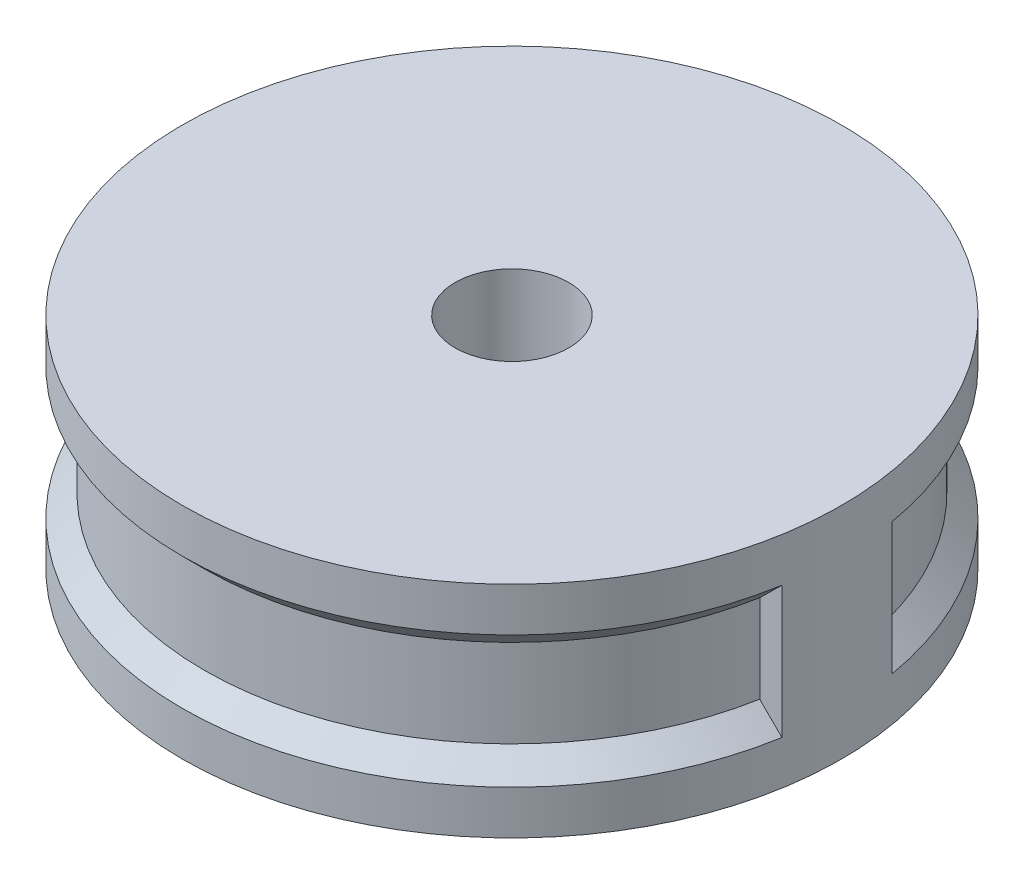
ISO-10303-21;
HEADER;
FILE_DESCRIPTION(('STEP AP214'),'2;1');
FILE_NAME('part.step','',(''),(''),'','','');
FILE_SCHEMA(('AUTOMOTIVE_DESIGN { 1 0 10303 214 1 1 1 1 }'));
ENDSEC;
DATA;
#1=APPLICATION_CONTEXT('core data for automotive mechanical design processes');
#2=APPLICATION_PROTOCOL_DEFINITION('international standard','automotive_design',2000,#1);
#3=PRODUCT_CONTEXT('',#1,'mechanical');
#4=PRODUCT('Part','Part','',(#3));
#5=PRODUCT_RELATED_PRODUCT_CATEGORY('part','',(#4));
#6=PRODUCT_DEFINITION_FORMATION('','',#4);
#7=PRODUCT_DEFINITION_CONTEXT('part definition',#1,'design');
#8=PRODUCT_DEFINITION('design','',#6,#7);
#9=PRODUCT_DEFINITION_SHAPE('','',#8);
#10=(LENGTH_UNIT() NAMED_UNIT(*) SI_UNIT(.MILLI.,.METRE.));
#11=(NAMED_UNIT(*) PLANE_ANGLE_UNIT() SI_UNIT($,.RADIAN.));
#12=(NAMED_UNIT(*) SI_UNIT($,.STERADIAN.) SOLID_ANGLE_UNIT());
#13=UNCERTAINTY_MEASURE_WITH_UNIT(LENGTH_MEASURE(1.E-05),#10,'distance_accuracy_value','');
#14=(GEOMETRIC_REPRESENTATION_CONTEXT(3) GLOBAL_UNCERTAINTY_ASSIGNED_CONTEXT((#13)) GLOBAL_UNIT_ASSIGNED_CONTEXT((#10,
#11,#12)) REPRESENTATION_CONTEXT('',''));
#15=CARTESIAN_POINT('',(0.,0.,0.));
#16=DIRECTION('',(0.,0.,1.));
#17=DIRECTION('',(1.,0.,0.));
#18=AXIS2_PLACEMENT_3D('',#15,#16,#17);
#19=CARTESIAN_POINT('',(0.,10.,0.));
#20=DIRECTION('',(0.,-1.,0.));
#21=DIRECTION('',(0.,0.,-1.));
#22=AXIS2_PLACEMENT_3D('',#19,#20,#21);
#23=CYLINDRICAL_SURFACE('',#22,14.);
#24=DIRECTION('',(0.,-1.,0.));
#25=VECTOR('',#24,1.);
#26=CARTESIAN_POINT('',(13.790199457749,10.,2.41462189907613));
#27=LINE('',#26,#25);
#28=CARTESIAN_POINT('',(13.790199457749,7.00000000000001,2.41462189907613));
#29=VERTEX_POINT('',#28);
#30=CARTESIAN_POINT('',(13.790199457749,3.,2.41462189907613));
#31=VERTEX_POINT('',#30);
#32=EDGE_CURVE('E164',#29,#31,#27,.T.);
#33=ORIENTED_EDGE('',*,*,#32,.F.);
#34=CARTESIAN_POINT('',(0.,7.00000000000001,0.));
#35=DIRECTION('',(0.,1.,0.));
#36=DIRECTION('',(0.,0.,1.));
#37=AXIS2_PLACEMENT_3D('',#34,#35,#36);
#38=CIRCLE('',#37,14.);
#39=CARTESIAN_POINT('',(13.790199457749,7.00000000000001,-2.41462189907614));
#40=VERTEX_POINT('',#39);
#41=EDGE_CURVE('E138',#29,#40,#38,.F.);
#42=ORIENTED_EDGE('',*,*,#41,.T.);
#43=DIRECTION('',(0.,-1.,0.));
#44=VECTOR('',#43,1.);
#45=CARTESIAN_POINT('',(13.790199457749,10.,-2.41462189907614));
#46=LINE('',#45,#44);
#47=CARTESIAN_POINT('',(13.790199457749,3.,-2.41462189907614));
#48=VERTEX_POINT('',#47);
#49=EDGE_CURVE('E194',#48,#40,#46,.F.);
#50=ORIENTED_EDGE('',*,*,#49,.F.);
#51=CARTESIAN_POINT('',(0.,3.,0.));
#52=DIRECTION('',(0.,1.,0.));
#53=DIRECTION('',(0.,0.,1.));
#54=AXIS2_PLACEMENT_3D('',#51,#52,#53);
#55=CIRCLE('',#54,14.);
#56=EDGE_CURVE('E198',#48,#31,#55,.T.);
#57=ORIENTED_EDGE('',*,*,#56,.T.);
#58=EDGE_LOOP('',(#33,#42,#50,#57));
#59=FACE_BOUND('',#58,.T.);
#60=ADVANCED_FACE('F57',(#59),#23,.T.);
#61=CARTESIAN_POINT('',(0.,8.,0.));
#62=DIRECTION('',(0.,1.,0.));
#63=DIRECTION('',(0.,0.,1.));
#64=AXIS2_PLACEMENT_3D('',#61,#62,#63);
#65=CONICAL_SURFACE('',#64,15.,0.785398163397453);
#66=CARTESIAN_POINT('',(12.3757858953759,5.62577033405038,-2.5));
#67=CARTESIAN_POINT('',(12.6955827246215,5.93924340125824,-2.5));
#68=CARTESIAN_POINT('',(13.0151495674288,6.25295088112389,-2.5));
#69=CARTESIAN_POINT('',(13.6538981383868,6.88075703972242,-2.5));
#70=CARTESIAN_POINT('',(13.973079866935,7.19485571805104,-2.5));
#71=CARTESIAN_POINT('',(14.6111336106725,7.82336717952537,-2.5));
#72=CARTESIAN_POINT('',(14.9300056259754,8.13777996255585,-2.5));
#73=CARTESIAN_POINT('',(15.5674908724013,8.76686843647522,-2.5));
#74=CARTESIAN_POINT('',(15.8861041032578,9.08154412763407,-2.5));
#75=CARTESIAN_POINT('',(16.2046130201221,9.39632529355011,-2.5));
#76=B_SPLINE_CURVE_WITH_KNOTS('',3,(#66,#67,#68,#69,#70,#71,#72,#73,#74,#75),.UNSPECIFIED.,.F.,
.F.,(4,2,2,2,4),(0.,1.34343495719193,2.68686852726906,4.03030160464996,5.37373606317071),.UNSPECIFIED.);
#77=CARTESIAN_POINT('',(13.790199457749,7.01497774113473,-2.5));
#78=VERTEX_POINT('',#77);
#79=CARTESIAN_POINT('',(14.790199457749,8.,-2.5));
#80=VERTEX_POINT('',#79);
#81=EDGE_CURVE('E80',#78,#80,#76,.T.);
#82=ORIENTED_EDGE('',*,*,#81,.F.);
#83=CARTESIAN_POINT('',(13.790199457749,7.01510262447272,2.5007));
#84=CARTESIAN_POINT('',(13.790199457749,6.98442599035101,2.32882080578309));
#85=CARTESIAN_POINT('',(13.790199457749,6.95673101614068,2.15640321524656));
#86=CARTESIAN_POINT('',(13.790199457749,6.90751342624309,1.81067555850645));
#87=CARTESIAN_POINT('',(13.790199457749,6.88599133115325,1.63736541828255));
#88=CARTESIAN_POINT('',(13.790199457749,6.84932660763172,1.28999805574772));
#89=CARTESIAN_POINT('',(13.790199457749,6.83418647966881,1.11594056755517));
#90=CARTESIAN_POINT('',(13.790199457749,6.81043966344074,0.767394307805772));
#91=CARTESIAN_POINT('',(13.790199457749,6.80183274263274,0.592905551821276));
#92=CARTESIAN_POINT('',(13.790199457749,6.78609877416651,0.0736346358576556));
#93=CARTESIAN_POINT('',(13.790199457749,6.78857757441452,-0.271486769294978));
#94=CARTESIAN_POINT('',(13.790199457749,6.81931830946131,-0.960386110849853));
#95=CARTESIAN_POINT('',(13.790199457749,6.8475667747092,-1.30416465488697));
#96=CARTESIAN_POINT('',(13.790199457749,6.90505758112435,-1.7891853538384));
#97=CARTESIAN_POINT('',(13.790199457749,6.92412561233425,-1.93169743981785));
#98=CARTESIAN_POINT('',(13.790199457749,6.96647992398493,-2.2164916779307));
#99=CARTESIAN_POINT('',(13.790199457749,6.9897775789506,-2.35877214001628));
#100=CARTESIAN_POINT('',(13.790199457749,7.01510262447272,-2.5007));
#101=B_SPLINE_CURVE_WITH_KNOTS('',3,(#83,#84,#85,#86,#87,#88,#89,#90,#91,#92,#93,#94,#95,#96,
#97,#98,#99,#100),.UNSPECIFIED.,.F.,.F.,(4,2,2,2,2,2,2,2,4),(0.,0.52376821018417,
1.04758058003074,1.57159799038902,2.09559674800926,3.1299493955207,4.16376170663854,
4.59505836230388,5.0275325434474),.UNSPECIFIED.);
#102=EDGE_CURVE('E203',#40,#78,#101,.T.);
#103=ORIENTED_EDGE('',*,*,#102,.F.);
#104=ORIENTED_EDGE('',*,*,#41,.F.);
#105=CARTESIAN_POINT('',(13.790199457749,7.01497774113474,2.5));
#106=VERTEX_POINT('',#105);
#107=EDGE_CURVE('E87',#106,#29,#101,.T.);
#108=ORIENTED_EDGE('',*,*,#107,.F.);
#109=CARTESIAN_POINT('',(16.2046130201221,9.39632529355011,2.5));
#110=CARTESIAN_POINT('',(15.8861041032578,9.08154412763407,2.5));
#111=CARTESIAN_POINT('',(15.5674908724013,8.76686843647522,2.5));
#112=CARTESIAN_POINT('',(14.9300056259754,8.13777996255585,2.5));
#113=CARTESIAN_POINT('',(14.6111336106725,7.82336717952537,2.5));
#114=CARTESIAN_POINT('',(13.973079866935,7.19485571805104,2.5));
#115=CARTESIAN_POINT('',(13.6538981383868,6.88075703972242,2.5));
#116=CARTESIAN_POINT('',(13.0151495674288,6.2529508811239,2.5));
#117=CARTESIAN_POINT('',(12.6955827246215,5.93924340125825,2.5));
#118=CARTESIAN_POINT('',(12.3757858953759,5.62577033405038,2.5));
#119=B_SPLINE_CURVE_WITH_KNOTS('',3,(#109,#110,#111,#112,#113,#114,#115,#116,#117,#118),
.UNSPECIFIED.,.F.,.F.,(4,2,2,2,4),(0.,1.34343445852074,2.68686753590165,4.03030110597877,
5.3737360631707),.UNSPECIFIED.);
#120=CARTESIAN_POINT('',(14.790199457749,8.,2.5));
#121=VERTEX_POINT('',#120);
#122=EDGE_CURVE('E156',#121,#106,#119,.T.);
#123=ORIENTED_EDGE('',*,*,#122,.F.);
#124=CARTESIAN_POINT('',(0.,8.,0.));
#125=DIRECTION('',(0.,1.,0.));
#126=DIRECTION('',(0.,0.,1.));
#127=AXIS2_PLACEMENT_3D('',#124,#125,#126);
#128=CIRCLE('',#127,15.);
#129=EDGE_CURVE('E143',#80,#121,#128,.T.);
#130=ORIENTED_EDGE('',*,*,#129,.F.);
#131=EDGE_LOOP('',(#82,#103,#104,#108,#123,#130));
#132=FACE_BOUND('',#131,.T.);
#133=ADVANCED_FACE('F167',(#132),#65,.T.);
#134=CARTESIAN_POINT('',(0.,3.,0.));
#135=DIRECTION('',(0.,-1.,0.));
#136=DIRECTION('',(0.,0.,-1.));
#137=AXIS2_PLACEMENT_3D('',#134,#135,#136);
#138=CONICAL_SURFACE('',#137,14.,0.785398163397442);
#139=CARTESIAN_POINT('',(16.2046130201221,0.60367470644984,-2.5));
#140=CARTESIAN_POINT('',(15.8861041032578,0.918455872365883,-2.5));
#141=CARTESIAN_POINT('',(15.5674908724013,1.23313156352474,-2.5));
#142=CARTESIAN_POINT('',(14.9300056259755,1.86222003744412,-2.5));
#143=CARTESIAN_POINT('',(14.6111336106725,2.17663282047461,-2.5));
#144=CARTESIAN_POINT('',(13.973079866935,2.80514428194896,-2.5));
#145=CARTESIAN_POINT('',(13.6538981383868,3.11924296027759,-2.5));
#146=CARTESIAN_POINT('',(13.0151495674288,3.74704911887612,-2.5));
#147=CARTESIAN_POINT('',(12.6955827246215,4.06075659874178,-2.5));
#148=CARTESIAN_POINT('',(12.3757858953759,4.37422966594965,-2.5));
#149=B_SPLINE_CURVE_WITH_KNOTS('',3,(#139,#140,#141,#142,#143,#144,#145,#146,#147,#148),
.UNSPECIFIED.,.F.,.F.,(4,2,2,2,4),(0.,1.34343445852076,2.68686753590168,4.03030110597882,
5.37373606317077),.UNSPECIFIED.);
#150=CARTESIAN_POINT('',(14.790199457749,2.,-2.5));
#151=VERTEX_POINT('',#150);
#152=CARTESIAN_POINT('',(13.790199457749,2.98502225886527,-2.5));
#153=VERTEX_POINT('',#152);
#154=EDGE_CURVE('E12',#151,#153,#149,.T.);
#155=ORIENTED_EDGE('',*,*,#154,.F.);
#156=CARTESIAN_POINT('',(0.,2.,0.));
#157=DIRECTION('',(0.,1.,0.));
#158=DIRECTION('',(0.,0.,1.));
#159=AXIS2_PLACEMENT_3D('',#156,#157,#158);
#160=CIRCLE('',#159,15.);
#161=CARTESIAN_POINT('',(14.790199457749,1.99999999999998,2.5));
#162=VERTEX_POINT('',#161);
#163=EDGE_CURVE('E117',#151,#162,#160,.T.);
#164=ORIENTED_EDGE('',*,*,#163,.T.);
#165=CARTESIAN_POINT('',(12.3757858953759,4.37422966594965,2.5));
#166=CARTESIAN_POINT('',(12.6955827246215,4.06075659874178,2.5));
#167=CARTESIAN_POINT('',(13.0151495674288,3.74704911887612,2.5));
#168=CARTESIAN_POINT('',(13.6538981383868,3.11924296027759,2.5));
#169=CARTESIAN_POINT('',(13.973079866935,2.80514428194896,2.5));
#170=CARTESIAN_POINT('',(14.6111336106725,2.17663282047461,2.5));
#171=CARTESIAN_POINT('',(14.9300056259755,1.86222003744412,2.5));
#172=CARTESIAN_POINT('',(15.5674908724013,1.23313156352474,2.5));
#173=CARTESIAN_POINT('',(15.8861041032578,0.918455872365883,2.5));
#174=CARTESIAN_POINT('',(16.2046130201221,0.603674706449837,2.5));
#175=B_SPLINE_CURVE_WITH_KNOTS('',3,(#165,#166,#167,#168,#169,#170,#171,#172,#173,#174),
.UNSPECIFIED.,.F.,.F.,(4,2,2,2,4),(0.,1.34343495719195,2.68686852726909,4.03030160465,
5.37373606317077),.UNSPECIFIED.);
#176=CARTESIAN_POINT('',(13.790199457749,2.98502225886527,2.5));
#177=VERTEX_POINT('',#176);
#178=EDGE_CURVE('E119',#177,#162,#175,.T.);
#179=ORIENTED_EDGE('',*,*,#178,.F.);
#180=CARTESIAN_POINT('',(13.790199457749,2.98489737552728,-2.5007));
#181=CARTESIAN_POINT('',(13.790199457749,3.015574009649,-2.32882080578309));
#182=CARTESIAN_POINT('',(13.790199457749,3.04326898385933,-2.15640321524656));
#183=CARTESIAN_POINT('',(13.790199457749,3.09248657375692,-1.81067555850644));
#184=CARTESIAN_POINT('',(13.790199457749,3.11400866884675,-1.63736541828254));
#185=CARTESIAN_POINT('',(13.790199457749,3.15067339236829,-1.28999805574771));
#186=CARTESIAN_POINT('',(13.790199457749,3.16581352033119,-1.11594056755516));
#187=CARTESIAN_POINT('',(13.790199457749,3.18956033655927,-0.767394307805764));
#188=CARTESIAN_POINT('',(13.790199457749,3.19816725736726,-0.592905551821266));
#189=CARTESIAN_POINT('',(13.790199457749,3.21390122583349,-0.0736346358576435));
#190=CARTESIAN_POINT('',(13.790199457749,3.21142242558548,0.271486769294992));
#191=CARTESIAN_POINT('',(13.790199457749,3.18068169053869,0.96038611084987));
#192=CARTESIAN_POINT('',(13.790199457749,3.1524332252908,1.30416465488699));
#193=CARTESIAN_POINT('',(13.790199457749,3.09494241887565,1.78918535383842));
#194=CARTESIAN_POINT('',(13.790199457749,3.07587438766575,1.93169743981786));
#195=CARTESIAN_POINT('',(13.790199457749,3.03352007601507,2.21649167793071));
#196=CARTESIAN_POINT('',(13.790199457749,3.0102224210494,2.35877214001628));
#197=CARTESIAN_POINT('',(13.790199457749,2.98489737552728,2.5007));
#198=B_SPLINE_CURVE_WITH_KNOTS('',3,(#180,#181,#182,#183,#184,#185,#186,#187,#188,#189,#190,
#191,#192,#193,#194,#195,#196,#197),.UNSPECIFIED.,.F.,.F.,(4,2,2,2,2,2,2,2,4),(0.,
0.523768210184172,1.04758058003074,1.57159799038902,2.09559674800927,3.12994939552072,
4.16376170663856,4.59505836230389,5.02753254344741),.UNSPECIFIED.);
#199=EDGE_CURVE('E137',#31,#177,#198,.T.);
#200=ORIENTED_EDGE('',*,*,#199,.F.);
#201=ORIENTED_EDGE('',*,*,#56,.F.);
#202=EDGE_CURVE('E73',#153,#48,#198,.T.);
#203=ORIENTED_EDGE('',*,*,#202,.F.);
#204=EDGE_LOOP('',(#155,#164,#179,#200,#201,#203));
#205=FACE_BOUND('',#204,.T.);
#206=ADVANCED_FACE('F60',(#205),#138,.T.);
#207=CARTESIAN_POINT('',(0.,10.,0.));
#208=DIRECTION('',(0.,-1.,0.));
#209=DIRECTION('',(0.,0.,-1.));
#210=AXIS2_PLACEMENT_3D('',#207,#208,#209);
#211=CYLINDRICAL_SURFACE('',#210,2.585);
#212=CARTESIAN_POINT('',(0.,10.,0.));
#213=DIRECTION('',(0.,1.,0.));
#214=DIRECTION('',(0.,0.,1.));
#215=AXIS2_PLACEMENT_3D('',#212,#213,#214);
#216=CIRCLE('',#215,2.585);
#217=CARTESIAN_POINT('',(0.,10.,2.585));
#218=VERTEX_POINT('',#217);
#219=EDGE_CURVE('E240',#218,#218,#216,.T.);
#220=ORIENTED_EDGE('',*,*,#219,.T.);
#221=EDGE_LOOP('',(#220));
#222=FACE_BOUND('',#221,.T.);
#223=CARTESIAN_POINT('',(0.,0.,0.));
#224=DIRECTION('',(0.,1.,0.));
#225=DIRECTION('',(0.,0.,1.));
#226=AXIS2_PLACEMENT_3D('',#223,#224,#225);
#227=CIRCLE('',#226,2.585);
#228=CARTESIAN_POINT('',(0.,0.,2.585));
#229=VERTEX_POINT('',#228);
#230=EDGE_CURVE('E126',#229,#229,#227,.T.);
#231=ORIENTED_EDGE('',*,*,#230,.F.);
#232=EDGE_LOOP('',(#231));
#233=FACE_BOUND('',#232,.T.);
#234=ADVANCED_FACE('F225',(#222,#233),#211,.F.);
#235=CARTESIAN_POINT('',(0.,10.,0.));
#236=DIRECTION('',(0.,1.,0.));
#237=DIRECTION('',(0.,0.,1.));
#238=AXIS2_PLACEMENT_3D('',#235,#236,#237);
#239=PLANE('',#238);
#240=CARTESIAN_POINT('',(0.,10.,0.));
#241=DIRECTION('',(0.,1.,0.));
#242=DIRECTION('',(0.,0.,1.));
#243=AXIS2_PLACEMENT_3D('',#240,#241,#242);
#244=CIRCLE('',#243,15.);
#245=CARTESIAN_POINT('',(0.,10.,15.));
#246=VERTEX_POINT('',#245);
#247=EDGE_CURVE('E202',#246,#246,#244,.T.);
#248=ORIENTED_EDGE('',*,*,#247,.T.);
#249=EDGE_LOOP('',(#248));
#250=FACE_BOUND('',#249,.T.);
#251=ORIENTED_EDGE('',*,*,#219,.F.);
#252=EDGE_LOOP('',(#251));
#253=FACE_BOUND('',#252,.T.);
#254=ADVANCED_FACE('F222',(#250,#253),#239,.T.);
#255=CARTESIAN_POINT('',(0.,0.,0.));
#256=DIRECTION('',(0.,1.,0.));
#257=DIRECTION('',(0.,0.,1.));
#258=AXIS2_PLACEMENT_3D('',#255,#256,#257);
#259=PLANE('',#258);
#260=CARTESIAN_POINT('',(0.,0.,0.));
#261=DIRECTION('',(0.,1.,0.));
#262=DIRECTION('',(0.,0.,1.));
#263=AXIS2_PLACEMENT_3D('',#260,#261,#262);
#264=CIRCLE('',#263,15.);
#265=CARTESIAN_POINT('',(0.,0.,15.));
#266=VERTEX_POINT('',#265);
#267=EDGE_CURVE('E127',#266,#266,#264,.T.);
#268=ORIENTED_EDGE('',*,*,#267,.F.);
#269=EDGE_LOOP('',(#268));
#270=FACE_BOUND('',#269,.T.);
#271=ORIENTED_EDGE('',*,*,#230,.T.);
#272=EDGE_LOOP('',(#271));
#273=FACE_BOUND('',#272,.T.);
#274=ADVANCED_FACE('F221',(#270,#273),#259,.F.);
#275=CARTESIAN_POINT('',(0.,2.,0.));
#276=DIRECTION('',(0.,-1.,0.));
#277=DIRECTION('',(0.,0.,-1.));
#278=AXIS2_PLACEMENT_3D('',#275,#276,#277);
#279=CYLINDRICAL_SURFACE('',#278,15.);
#280=ORIENTED_EDGE('',*,*,#163,.F.);
#281=DIRECTION('',(0.,-1.,0.));
#282=VECTOR('',#281,1.);
#283=CARTESIAN_POINT('',(14.790199457749,10.,-2.5));
#284=LINE('',#283,#282);
#285=EDGE_CURVE('E153',#80,#151,#284,.T.);
#286=ORIENTED_EDGE('',*,*,#285,.F.);
#287=ORIENTED_EDGE('',*,*,#129,.T.);
#288=DIRECTION('',(0.,-1.,0.));
#289=VECTOR('',#288,1.);
#290=CARTESIAN_POINT('',(14.790199457749,10.,2.5));
#291=LINE('',#290,#289);
#292=EDGE_CURVE('E133',#121,#162,#291,.T.);
#293=ORIENTED_EDGE('',*,*,#292,.T.);
#294=EDGE_LOOP('',(#280,#286,#287,#293));
#295=FACE_BOUND('',#294,.T.);
#296=ORIENTED_EDGE('',*,*,#267,.T.);
#297=EDGE_LOOP('',(#296));
#298=FACE_BOUND('',#297,.T.);
#299=ORIENTED_EDGE('',*,*,#247,.F.);
#300=EDGE_LOOP('',(#299));
#301=FACE_BOUND('',#300,.T.);
#302=ADVANCED_FACE('F141',(#295,#298,#301),#279,.T.);
#303=CARTESIAN_POINT('',(14.790199457749,10.,-2.5));
#304=DIRECTION('',(0.,0.,1.));
#305=DIRECTION('',(1.,0.,0.));
#306=AXIS2_PLACEMENT_3D('',#303,#304,#305);
#307=PLANE('',#306);
#308=DIRECTION('',(0.,-1.,0.));
#309=VECTOR('',#308,1.);
#310=CARTESIAN_POINT('',(13.790199457749,10.,-2.5));
#311=LINE('',#310,#309);
#312=EDGE_CURVE('E147',#78,#153,#311,.T.);
#313=ORIENTED_EDGE('',*,*,#312,.F.);
#314=ORIENTED_EDGE('',*,*,#81,.T.);
#315=ORIENTED_EDGE('',*,*,#285,.T.);
#316=ORIENTED_EDGE('',*,*,#154,.T.);
#317=EDGE_LOOP('',(#313,#314,#315,#316));
#318=FACE_BOUND('',#317,.T.);
#319=ADVANCED_FACE('F200',(#318),#307,.F.);
#320=CARTESIAN_POINT('',(13.790199457749,10.,-2.5));
#321=DIRECTION('',(1.,0.,0.));
#322=DIRECTION('',(0.,0.,-1.));
#323=AXIS2_PLACEMENT_3D('',#320,#321,#322);
#324=PLANE('',#323);
#325=ORIENTED_EDGE('',*,*,#49,.T.);
#326=ORIENTED_EDGE('',*,*,#102,.T.);
#327=ORIENTED_EDGE('',*,*,#312,.T.);
#328=ORIENTED_EDGE('',*,*,#202,.T.);
#329=EDGE_LOOP('',(#325,#326,#327,#328));
#330=FACE_BOUND('',#329,.T.);
#331=ADVANCED_FACE('F174',(#330),#324,.F.);
#332=DIRECTION('',(0.,-1.,0.));
#333=VECTOR('',#332,1.);
#334=CARTESIAN_POINT('',(13.790199457749,10.,2.5));
#335=LINE('',#334,#333);
#336=EDGE_CURVE('E135',#106,#177,#335,.T.);
#337=ORIENTED_EDGE('',*,*,#336,.F.);
#338=ORIENTED_EDGE('',*,*,#107,.T.);
#339=ORIENTED_EDGE('',*,*,#32,.T.);
#340=ORIENTED_EDGE('',*,*,#199,.T.);
#341=EDGE_LOOP('',(#337,#338,#339,#340));
#342=FACE_BOUND('',#341,.T.);
#343=ADVANCED_FACE('F173',(#342),#324,.F.);
#344=CARTESIAN_POINT('',(13.790199457749,10.,2.5));
#345=DIRECTION('',(0.,0.,-1.));
#346=DIRECTION('',(-1.,0.,0.));
#347=AXIS2_PLACEMENT_3D('',#344,#345,#346);
#348=PLANE('',#347);
#349=ORIENTED_EDGE('',*,*,#292,.F.);
#350=ORIENTED_EDGE('',*,*,#122,.T.);
#351=ORIENTED_EDGE('',*,*,#336,.T.);
#352=ORIENTED_EDGE('',*,*,#178,.T.);
#353=EDGE_LOOP('',(#349,#350,#351,#352));
#354=FACE_BOUND('',#353,.T.);
#355=ADVANCED_FACE('F132',(#354),#348,.F.);
#356=CLOSED_SHELL('',(#60,#133,#206,#234,#254,#274,#302,#319,#331,#343,#355));
#357=MANIFOLD_SOLID_BREP('B2',#356);
#358=ADVANCED_BREP_SHAPE_REPRESENTATION('',(#18,#357),#14);
#359=SHAPE_DEFINITION_REPRESENTATION(#9,#358);
ENDSEC;
END-ISO-10303-21;
